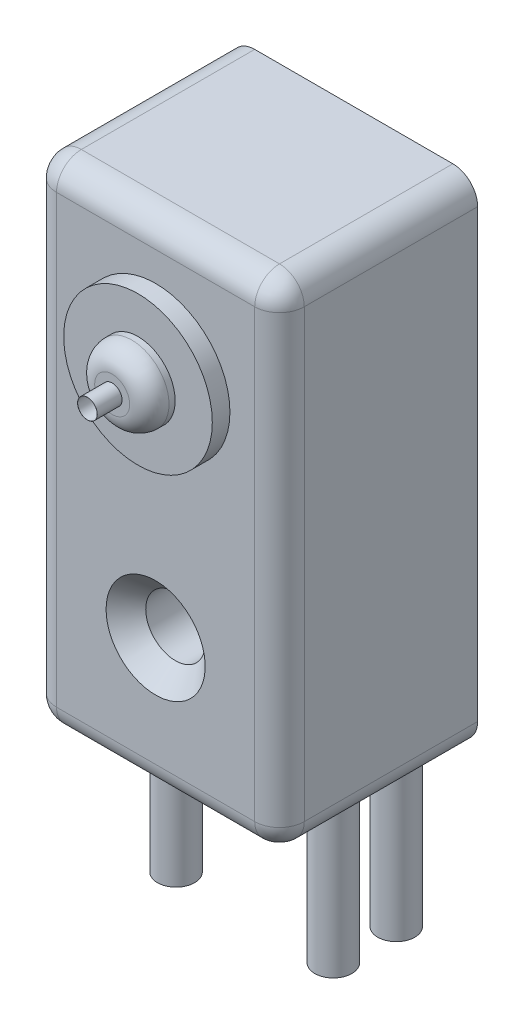
ISO-10303-21;
HEADER;
FILE_DESCRIPTION(('STEP AP214'),'2;1');
FILE_NAME('part.step','',(''),(''),'','','');
FILE_SCHEMA(('AUTOMOTIVE_DESIGN { 1 0 10303 214 1 1 1 1 }'));
ENDSEC;
DATA;
#1=APPLICATION_CONTEXT('core data for automotive mechanical design processes');
#2=APPLICATION_PROTOCOL_DEFINITION('international standard','automotive_design',2000,#1);
#3=PRODUCT_CONTEXT('',#1,'mechanical');
#4=PRODUCT('Part','Part','',(#3));
#5=PRODUCT_RELATED_PRODUCT_CATEGORY('part','',(#4));
#6=PRODUCT_DEFINITION_FORMATION('','',#4);
#7=PRODUCT_DEFINITION_CONTEXT('part definition',#1,'design');
#8=PRODUCT_DEFINITION('design','',#6,#7);
#9=PRODUCT_DEFINITION_SHAPE('','',#8);
#10=(LENGTH_UNIT() NAMED_UNIT(*) SI_UNIT(.MILLI.,.METRE.));
#11=(NAMED_UNIT(*) PLANE_ANGLE_UNIT() SI_UNIT($,.RADIAN.));
#12=(NAMED_UNIT(*) SI_UNIT($,.STERADIAN.) SOLID_ANGLE_UNIT());
#13=UNCERTAINTY_MEASURE_WITH_UNIT(LENGTH_MEASURE(1.E-05),#10,'distance_accuracy_value','');
#14=(GEOMETRIC_REPRESENTATION_CONTEXT(3) GLOBAL_UNCERTAINTY_ASSIGNED_CONTEXT((#13)) GLOBAL_UNIT_ASSIGNED_CONTEXT((#10,
#11,#12)) REPRESENTATION_CONTEXT('',''));
#15=CARTESIAN_POINT('',(0.,0.,0.));
#16=DIRECTION('',(0.,0.,1.));
#17=DIRECTION('',(1.,0.,0.));
#18=AXIS2_PLACEMENT_3D('',#15,#16,#17);
#19=CARTESIAN_POINT('',(0.,5.18314912915231,8.));
#20=DIRECTION('',(0.,1.,0.));
#21=DIRECTION('',(-1.,0.,0.));
#22=AXIS2_PLACEMENT_3D('',#19,#20,#21);
#23=PLANE('',#22);
#24=DIRECTION('',(1.,0.,0.));
#25=VECTOR('',#24,1.);
#26=CARTESIAN_POINT('',(0.,5.18314912915231,0.));
#27=LINE('',#26,#25);
#28=CARTESIAN_POINT('',(-4.,5.18314912915231,0.));
#29=VERTEX_POINT('',#28);
#30=CARTESIAN_POINT('',(4.,5.18314912915231,0.));
#31=VERTEX_POINT('',#30);
#32=EDGE_CURVE('E131',#29,#31,#27,.T.);
#33=ORIENTED_EDGE('',*,*,#32,.F.);
#34=DIRECTION('',(0.,0.,-1.));
#35=VECTOR('',#34,1.);
#36=CARTESIAN_POINT('',(-4.,5.18314912915231,8.));
#37=LINE('',#36,#35);
#38=CARTESIAN_POINT('',(-4.,5.18314912915231,7.));
#39=VERTEX_POINT('',#38);
#40=EDGE_CURVE('E275',#29,#39,#37,.F.);
#41=ORIENTED_EDGE('',*,*,#40,.T.);
#42=DIRECTION('',(1.,0.,0.));
#43=VECTOR('',#42,1.);
#44=CARTESIAN_POINT('',(0.,5.18314912915231,7.));
#45=LINE('',#44,#43);
#46=CARTESIAN_POINT('',(4.,5.18314912915231,7.));
#47=VERTEX_POINT('',#46);
#48=EDGE_CURVE('E296',#39,#47,#45,.T.);
#49=ORIENTED_EDGE('',*,*,#48,.T.);
#50=DIRECTION('',(0.,0.,-1.));
#51=VECTOR('',#50,1.);
#52=CARTESIAN_POINT('',(4.,5.18314912915231,8.));
#53=LINE('',#52,#51);
#54=EDGE_CURVE('E462',#47,#31,#53,.T.);
#55=ORIENTED_EDGE('',*,*,#54,.T.);
#56=EDGE_LOOP('',(#33,#41,#49,#55));
#57=FACE_BOUND('',#56,.T.);
#58=ADVANCED_FACE('F20',(#57),#23,.T.);
#59=CARTESIAN_POINT('',(-5.,-4.8168508708477,8.));
#60=DIRECTION('',(1.,0.,0.));
#61=DIRECTION('',(0.,1.,0.));
#62=AXIS2_PLACEMENT_3D('',#59,#60,#61);
#63=PLANE('',#62);
#64=DIRECTION('',(0.,-1.,0.));
#65=VECTOR('',#64,1.);
#66=CARTESIAN_POINT('',(-5.,5.18314912915231,7.));
#67=LINE('',#66,#65);
#68=CARTESIAN_POINT('',(-5.,-13.8168508708477,7.));
#69=VERTEX_POINT('',#68);
#70=CARTESIAN_POINT('',(-5.,4.18314912915231,7.));
#71=VERTEX_POINT('',#70);
#72=EDGE_CURVE('E42',#69,#71,#67,.F.);
#73=ORIENTED_EDGE('',*,*,#72,.T.);
#74=DIRECTION('',(0.,0.,-1.));
#75=VECTOR('',#74,1.);
#76=CARTESIAN_POINT('',(-5.,4.18314912915231,0.));
#77=LINE('',#76,#75);
#78=CARTESIAN_POINT('',(-5.,4.18314912915231,0.));
#79=VERTEX_POINT('',#78);
#80=EDGE_CURVE('E276',#71,#79,#77,.T.);
#81=ORIENTED_EDGE('',*,*,#80,.T.);
#82=DIRECTION('',(0.,-1.,0.));
#83=VECTOR('',#82,1.);
#84=CARTESIAN_POINT('',(-5.,-4.8168508708477,0.));
#85=LINE('',#84,#83);
#86=CARTESIAN_POINT('',(-5.,-13.8168508708477,0.));
#87=VERTEX_POINT('',#86);
#88=EDGE_CURVE('E378',#79,#87,#85,.T.);
#89=ORIENTED_EDGE('',*,*,#88,.T.);
#90=DIRECTION('',(0.,0.,-1.));
#91=VECTOR('',#90,1.);
#92=CARTESIAN_POINT('',(-5.,-13.8168508708477,8.));
#93=LINE('',#92,#91);
#94=EDGE_CURVE('E51',#87,#69,#93,.F.);
#95=ORIENTED_EDGE('',*,*,#94,.T.);
#96=EDGE_LOOP('',(#73,#81,#89,#95));
#97=FACE_BOUND('',#96,.T.);
#98=ADVANCED_FACE('F405',(#97),#63,.F.);
#99=CARTESIAN_POINT('',(0.,-14.8168508708477,8.));
#100=DIRECTION('',(0.,1.,0.));
#101=DIRECTION('',(-1.,0.,0.));
#102=AXIS2_PLACEMENT_3D('',#99,#100,#101);
#103=PLANE('',#102);
#104=CARTESIAN_POINT('',(3.175,-14.8168508708477,1.46));
#105=DIRECTION('',(0.,1.,0.));
#106=DIRECTION('',(-1.,0.,0.));
#107=AXIS2_PLACEMENT_3D('',#104,#105,#106);
#108=CIRCLE('',#107,0.75);
#109=CARTESIAN_POINT('',(2.425,-14.8168508708477,1.46));
#110=VERTEX_POINT('',#109);
#111=EDGE_CURVE('E12',#110,#110,#108,.F.);
#112=ORIENTED_EDGE('',*,*,#111,.F.);
#113=EDGE_LOOP('',(#112));
#114=FACE_BOUND('',#113,.T.);
#115=CARTESIAN_POINT('',(3.175,-14.8168508708477,4.));
#116=DIRECTION('',(0.,1.,0.));
#117=DIRECTION('',(1.,0.,0.));
#118=AXIS2_PLACEMENT_3D('',#115,#116,#117);
#119=CIRCLE('',#118,0.75);
#120=CARTESIAN_POINT('',(3.925,-14.8168508708477,4.));
#121=VERTEX_POINT('',#120);
#122=EDGE_CURVE('E196',#121,#121,#119,.T.);
#123=ORIENTED_EDGE('',*,*,#122,.T.);
#124=EDGE_LOOP('',(#123));
#125=FACE_BOUND('',#124,.T.);
#126=CARTESIAN_POINT('',(-3.175,-14.8168508708477,4.));
#127=DIRECTION('',(0.,1.,0.));
#128=DIRECTION('',(-1.,0.,0.));
#129=AXIS2_PLACEMENT_3D('',#126,#127,#128);
#130=CIRCLE('',#129,0.75);
#131=CARTESIAN_POINT('',(-3.925,-14.8168508708477,4.));
#132=VERTEX_POINT('',#131);
#133=EDGE_CURVE('E30',#132,#132,#130,.F.);
#134=ORIENTED_EDGE('',*,*,#133,.F.);
#135=EDGE_LOOP('',(#134));
#136=FACE_BOUND('',#135,.T.);
#137=DIRECTION('',(1.,0.,0.));
#138=VECTOR('',#137,1.);
#139=CARTESIAN_POINT('',(0.,-14.8168508708477,0.));
#140=LINE('',#139,#138);
#141=CARTESIAN_POINT('',(-4.,-14.8168508708477,0.));
#142=VERTEX_POINT('',#141);
#143=CARTESIAN_POINT('',(4.,-14.8168508708477,0.));
#144=VERTEX_POINT('',#143);
#145=EDGE_CURVE('E148',#142,#144,#140,.T.);
#146=ORIENTED_EDGE('',*,*,#145,.T.);
#147=DIRECTION('',(0.,0.,-1.));
#148=VECTOR('',#147,1.);
#149=CARTESIAN_POINT('',(4.,-14.8168508708477,8.));
#150=LINE('',#149,#148);
#151=CARTESIAN_POINT('',(4.,-14.8168508708477,7.));
#152=VERTEX_POINT('',#151);
#153=EDGE_CURVE('E465',#144,#152,#150,.F.);
#154=ORIENTED_EDGE('',*,*,#153,.T.);
#155=DIRECTION('',(1.,0.,0.));
#156=VECTOR('',#155,1.);
#157=CARTESIAN_POINT('',(-5.,-14.8168508708477,7.));
#158=LINE('',#157,#156);
#159=CARTESIAN_POINT('',(-4.,-14.8168508708477,7.));
#160=VERTEX_POINT('',#159);
#161=EDGE_CURVE('E468',#152,#160,#158,.F.);
#162=ORIENTED_EDGE('',*,*,#161,.T.);
#163=DIRECTION('',(0.,0.,-1.));
#164=VECTOR('',#163,1.);
#165=CARTESIAN_POINT('',(-4.,-14.8168508708477,8.));
#166=LINE('',#165,#164);
#167=EDGE_CURVE('E447',#160,#142,#166,.T.);
#168=ORIENTED_EDGE('',*,*,#167,.T.);
#169=EDGE_LOOP('',(#146,#154,#162,#168));
#170=FACE_BOUND('',#169,.T.);
#171=ADVANCED_FACE('F401',(#114,#125,#136,#170),#103,.F.);
#172=CARTESIAN_POINT('',(5.,-4.81685087084769,8.));
#173=DIRECTION('',(1.,0.,0.));
#174=DIRECTION('',(0.,1.,0.));
#175=AXIS2_PLACEMENT_3D('',#172,#173,#174);
#176=PLANE('',#175);
#177=DIRECTION('',(0.,-1.,0.));
#178=VECTOR('',#177,1.);
#179=CARTESIAN_POINT('',(5.,-4.81685087084769,0.));
#180=LINE('',#179,#178);
#181=CARTESIAN_POINT('',(5.,4.18314912915232,0.));
#182=VERTEX_POINT('',#181);
#183=CARTESIAN_POINT('',(5.,-13.8168508708477,0.));
#184=VERTEX_POINT('',#183);
#185=EDGE_CURVE('E128',#182,#184,#180,.T.);
#186=ORIENTED_EDGE('',*,*,#185,.F.);
#187=DIRECTION('',(0.,0.,-1.));
#188=VECTOR('',#187,1.);
#189=CARTESIAN_POINT('',(5.,4.18314912915232,8.));
#190=LINE('',#189,#188);
#191=CARTESIAN_POINT('',(5.,4.18314912915232,7.));
#192=VERTEX_POINT('',#191);
#193=EDGE_CURVE('E142',#182,#192,#190,.F.);
#194=ORIENTED_EDGE('',*,*,#193,.T.);
#195=DIRECTION('',(0.,-1.,0.));
#196=VECTOR('',#195,1.);
#197=CARTESIAN_POINT('',(5.,-4.81685087084769,7.));
#198=LINE('',#197,#196);
#199=CARTESIAN_POINT('',(5.,-13.8168508708477,7.));
#200=VERTEX_POINT('',#199);
#201=EDGE_CURVE('E156',#192,#200,#198,.T.);
#202=ORIENTED_EDGE('',*,*,#201,.T.);
#203=DIRECTION('',(0.,0.,-1.));
#204=VECTOR('',#203,1.);
#205=CARTESIAN_POINT('',(5.,-13.8168508708477,0.));
#206=LINE('',#205,#204);
#207=EDGE_CURVE('E145',#200,#184,#206,.T.);
#208=ORIENTED_EDGE('',*,*,#207,.T.);
#209=EDGE_LOOP('',(#186,#194,#202,#208));
#210=FACE_BOUND('',#209,.T.);
#211=ADVANCED_FACE('F140',(#210),#176,.T.);
#212=CARTESIAN_POINT('',(0.,-4.8168508708477,8.));
#213=DIRECTION('',(0.,0.,1.));
#214=DIRECTION('',(1.,0.,0.));
#215=AXIS2_PLACEMENT_3D('',#212,#213,#214);
#216=PLANE('',#215);
#217=CARTESIAN_POINT('',(0.,-9.39139091447953,8.));
#218=DIRECTION('',(0.,0.,-1.));
#219=DIRECTION('',(-1.,0.,0.));
#220=AXIS2_PLACEMENT_3D('',#217,#218,#219);
#221=CIRCLE('',#220,2.);
#222=CARTESIAN_POINT('',(-2.,-9.39139091447953,8.));
#223=VERTEX_POINT('',#222);
#224=EDGE_CURVE('E183',#223,#223,#221,.T.);
#225=ORIENTED_EDGE('',*,*,#224,.T.);
#226=EDGE_LOOP('',(#225));
#227=FACE_BOUND('',#226,.T.);
#228=DIRECTION('',(1.,0.,0.));
#229=VECTOR('',#228,1.);
#230=CARTESIAN_POINT('',(5.,-13.8168508708477,8.));
#231=LINE('',#230,#229);
#232=CARTESIAN_POINT('',(-4.,-13.8168508708477,8.));
#233=VERTEX_POINT('',#232);
#234=CARTESIAN_POINT('',(4.,-13.8168508708477,8.));
#235=VERTEX_POINT('',#234);
#236=EDGE_CURVE('E169',#233,#235,#231,.T.);
#237=ORIENTED_EDGE('',*,*,#236,.T.);
#238=DIRECTION('',(0.,-1.,0.));
#239=VECTOR('',#238,1.);
#240=CARTESIAN_POINT('',(4.,-4.8168508708477,8.));
#241=LINE('',#240,#239);
#242=CARTESIAN_POINT('',(4.,4.18314912915232,8.));
#243=VERTEX_POINT('',#242);
#244=EDGE_CURVE('E173',#235,#243,#241,.F.);
#245=ORIENTED_EDGE('',*,*,#244,.T.);
#246=DIRECTION('',(1.,0.,0.));
#247=VECTOR('',#246,1.);
#248=CARTESIAN_POINT('',(0.,4.18314912915232,8.));
#249=LINE('',#248,#247);
#250=CARTESIAN_POINT('',(-4.,4.18314912915231,8.));
#251=VERTEX_POINT('',#250);
#252=EDGE_CURVE('E162',#243,#251,#249,.F.);
#253=ORIENTED_EDGE('',*,*,#252,.T.);
#254=DIRECTION('',(0.,-1.,0.));
#255=VECTOR('',#254,1.);
#256=CARTESIAN_POINT('',(-4.,-14.8168508708477,8.));
#257=LINE('',#256,#255);
#258=EDGE_CURVE('E155',#251,#233,#257,.T.);
#259=ORIENTED_EDGE('',*,*,#258,.T.);
#260=EDGE_LOOP('',(#237,#245,#253,#259));
#261=FACE_BOUND('',#260,.T.);
#262=CARTESIAN_POINT('',(0.,0.,8.));
#263=DIRECTION('',(0.,0.,1.));
#264=DIRECTION('',(1.,0.,0.));
#265=AXIS2_PLACEMENT_3D('',#262,#263,#264);
#266=CIRCLE('',#265,3.);
#267=CARTESIAN_POINT('',(3.,0.,8.));
#268=VERTEX_POINT('',#267);
#269=EDGE_CURVE('E147',#268,#268,#266,.T.);
#270=ORIENTED_EDGE('',*,*,#269,.F.);
#271=EDGE_LOOP('',(#270));
#272=FACE_BOUND('',#271,.T.);
#273=ADVANCED_FACE('F285',(#227,#261,#272),#216,.T.);
#274=CARTESIAN_POINT('',(0.,-4.8168508708477,0.));
#275=DIRECTION('',(0.,0.,1.));
#276=DIRECTION('',(1.,0.,0.));
#277=AXIS2_PLACEMENT_3D('',#274,#275,#276);
#278=PLANE('',#277);
#279=CARTESIAN_POINT('',(0.,-9.39139091447953,0.));
#280=DIRECTION('',(0.,0.,1.));
#281=DIRECTION('',(1.,0.,0.));
#282=AXIS2_PLACEMENT_3D('',#279,#280,#281);
#283=CIRCLE('',#282,1.2);
#284=CARTESIAN_POINT('',(1.2,-9.39139091447953,0.));
#285=VERTEX_POINT('',#284);
#286=EDGE_CURVE('E24',#285,#285,#283,.F.);
#287=ORIENTED_EDGE('',*,*,#286,.F.);
#288=EDGE_LOOP('',(#287));
#289=FACE_BOUND('',#288,.T.);
#290=ORIENTED_EDGE('',*,*,#88,.F.);
#291=CARTESIAN_POINT('',(-4.,4.18314912915231,0.));
#292=DIRECTION('',(0.,0.,1.));
#293=DIRECTION('',(1.,0.,0.));
#294=AXIS2_PLACEMENT_3D('',#291,#292,#293);
#295=CIRCLE('',#294,1.);
#296=EDGE_CURVE('E136',#79,#29,#295,.F.);
#297=ORIENTED_EDGE('',*,*,#296,.T.);
#298=ORIENTED_EDGE('',*,*,#32,.T.);
#299=CARTESIAN_POINT('',(4.,4.18314912915232,0.));
#300=DIRECTION('',(0.,0.,1.));
#301=DIRECTION('',(1.,0.,0.));
#302=AXIS2_PLACEMENT_3D('',#299,#300,#301);
#303=CIRCLE('',#302,1.);
#304=EDGE_CURVE('E124',#31,#182,#303,.F.);
#305=ORIENTED_EDGE('',*,*,#304,.T.);
#306=ORIENTED_EDGE('',*,*,#185,.T.);
#307=CARTESIAN_POINT('',(4.,-13.8168508708477,0.));
#308=DIRECTION('',(0.,0.,1.));
#309=DIRECTION('',(1.,0.,0.));
#310=AXIS2_PLACEMENT_3D('',#307,#308,#309);
#311=CIRCLE('',#310,1.);
#312=EDGE_CURVE('E137',#184,#144,#311,.F.);
#313=ORIENTED_EDGE('',*,*,#312,.T.);
#314=ORIENTED_EDGE('',*,*,#145,.F.);
#315=CARTESIAN_POINT('',(-4.,-13.8168508708477,0.));
#316=DIRECTION('',(0.,0.,1.));
#317=DIRECTION('',(1.,0.,0.));
#318=AXIS2_PLACEMENT_3D('',#315,#316,#317);
#319=CIRCLE('',#318,1.);
#320=EDGE_CURVE('E278',#142,#87,#319,.F.);
#321=ORIENTED_EDGE('',*,*,#320,.T.);
#322=EDGE_LOOP('',(#290,#297,#298,#305,#306,#313,#314,#321));
#323=FACE_BOUND('',#322,.T.);
#324=ADVANCED_FACE('F127',(#289,#323),#278,.F.);
#325=CARTESIAN_POINT('',(0.,0.,9.7536));
#326=DIRECTION('',(0.,0.,-1.));
#327=DIRECTION('',(-1.,0.,0.));
#328=AXIS2_PLACEMENT_3D('',#325,#326,#327);
#329=CYLINDRICAL_SURFACE('',#328,1.5);
#330=CARTESIAN_POINT('',(0.,0.,8.95985));
#331=DIRECTION('',(0.,0.,1.));
#332=DIRECTION('',(1.,0.,0.));
#333=AXIS2_PLACEMENT_3D('',#330,#331,#332);
#334=CIRCLE('',#333,1.5);
#335=CARTESIAN_POINT('',(1.5,0.,8.95985));
#336=VERTEX_POINT('',#335);
#337=EDGE_CURVE('E319',#336,#336,#334,.F.);
#338=ORIENTED_EDGE('',*,*,#337,.T.);
#339=EDGE_LOOP('',(#338));
#340=FACE_BOUND('',#339,.T.);
#341=CARTESIAN_POINT('',(0.,0.,8.7122));
#342=DIRECTION('',(0.,0.,1.));
#343=DIRECTION('',(1.,0.,0.));
#344=AXIS2_PLACEMENT_3D('',#341,#342,#343);
#345=CIRCLE('',#344,1.5);
#346=CARTESIAN_POINT('',(1.5,0.,8.7122));
#347=VERTEX_POINT('',#346);
#348=EDGE_CURVE('E346',#347,#347,#345,.T.);
#349=ORIENTED_EDGE('',*,*,#348,.T.);
#350=EDGE_LOOP('',(#349));
#351=FACE_BOUND('',#350,.T.);
#352=ADVANCED_FACE('F398',(#340,#351),#329,.T.);
#353=CARTESIAN_POINT('',(0.,-4.8168508708477,9.7536));
#354=DIRECTION('',(0.,0.,1.));
#355=DIRECTION('',(1.,0.,0.));
#356=AXIS2_PLACEMENT_3D('',#353,#354,#355);
#357=PLANE('',#356);
#358=CARTESIAN_POINT('',(0.,0.,9.7536));
#359=DIRECTION('',(0.,0.,1.));
#360=DIRECTION('',(1.,0.,0.));
#361=AXIS2_PLACEMENT_3D('',#358,#359,#360);
#362=CIRCLE('',#361,0.70625);
#363=CARTESIAN_POINT('',(0.70625,0.,9.7536));
#364=VERTEX_POINT('',#363);
#365=EDGE_CURVE('E323',#364,#364,#362,.T.);
#366=ORIENTED_EDGE('',*,*,#365,.T.);
#367=EDGE_LOOP('',(#366));
#368=FACE_BOUND('',#367,.T.);
#369=CARTESIAN_POINT('',(0.,0.,9.7536));
#370=DIRECTION('',(0.,0.,1.));
#371=DIRECTION('',(1.,0.,0.));
#372=AXIS2_PLACEMENT_3D('',#369,#370,#371);
#373=CIRCLE('',#372,0.396875);
#374=CARTESIAN_POINT('',(0.396875,0.,9.7536));
#375=VERTEX_POINT('',#374);
#376=EDGE_CURVE('E329',#375,#375,#373,.T.);
#377=ORIENTED_EDGE('',*,*,#376,.F.);
#378=EDGE_LOOP('',(#377));
#379=FACE_BOUND('',#378,.T.);
#380=ADVANCED_FACE('F765',(#368,#379),#357,.T.);
#381=CARTESIAN_POINT('',(0.,0.,8.7122));
#382=DIRECTION('',(0.,0.,-1.));
#383=DIRECTION('',(-1.,0.,0.));
#384=AXIS2_PLACEMENT_3D('',#381,#382,#383);
#385=CYLINDRICAL_SURFACE('',#384,3.);
#386=ORIENTED_EDGE('',*,*,#269,.T.);
#387=EDGE_LOOP('',(#386));
#388=FACE_BOUND('',#387,.T.);
#389=CARTESIAN_POINT('',(0.,0.,8.7122));
#390=DIRECTION('',(0.,0.,1.));
#391=DIRECTION('',(1.,0.,0.));
#392=AXIS2_PLACEMENT_3D('',#389,#390,#391);
#393=CIRCLE('',#392,3.);
#394=CARTESIAN_POINT('',(3.,0.,8.7122));
#395=VERTEX_POINT('',#394);
#396=EDGE_CURVE('E350',#395,#395,#393,.T.);
#397=ORIENTED_EDGE('',*,*,#396,.F.);
#398=EDGE_LOOP('',(#397));
#399=FACE_BOUND('',#398,.T.);
#400=ADVANCED_FACE('F389',(#388,#399),#385,.T.);
#401=CARTESIAN_POINT('',(0.,-4.8168508708477,8.7122));
#402=DIRECTION('',(0.,0.,1.));
#403=DIRECTION('',(1.,0.,0.));
#404=AXIS2_PLACEMENT_3D('',#401,#402,#403);
#405=PLANE('',#404);
#406=ORIENTED_EDGE('',*,*,#348,.F.);
#407=EDGE_LOOP('',(#406));
#408=FACE_BOUND('',#407,.T.);
#409=ORIENTED_EDGE('',*,*,#396,.T.);
#410=EDGE_LOOP('',(#409));
#411=FACE_BOUND('',#410,.T.);
#412=ADVANCED_FACE('F786',(#408,#411),#405,.T.);
#413=CARTESIAN_POINT('',(0.,0.,10.7536));
#414=DIRECTION('',(0.,0.,-1.));
#415=DIRECTION('',(-1.,0.,0.));
#416=AXIS2_PLACEMENT_3D('',#413,#414,#415);
#417=CYLINDRICAL_SURFACE('',#416,0.394335);
#418=CARTESIAN_POINT('',(0.,0.,10.7536));
#419=DIRECTION('',(0.,0.,1.));
#420=DIRECTION('',(1.,0.,0.));
#421=AXIS2_PLACEMENT_3D('',#418,#419,#420);
#422=CIRCLE('',#421,0.394335);
#423=CARTESIAN_POINT('',(0.394335,0.,10.7536));
#424=VERTEX_POINT('',#423);
#425=EDGE_CURVE('E360',#424,#424,#422,.T.);
#426=ORIENTED_EDGE('',*,*,#425,.T.);
#427=EDGE_LOOP('',(#426));
#428=FACE_BOUND('',#427,.T.);
#429=CARTESIAN_POINT('',(0.,0.,9.7536));
#430=DIRECTION('',(0.,0.,1.));
#431=DIRECTION('',(1.,0.,0.));
#432=AXIS2_PLACEMENT_3D('',#429,#430,#431);
#433=CIRCLE('',#432,0.394335);
#434=CARTESIAN_POINT('',(0.394335,0.,9.7536));
#435=VERTEX_POINT('',#434);
#436=EDGE_CURVE('E213',#435,#435,#433,.T.);
#437=ORIENTED_EDGE('',*,*,#436,.F.);
#438=EDGE_LOOP('',(#437));
#439=FACE_BOUND('',#438,.T.);
#440=ADVANCED_FACE('F796',(#428,#439),#417,.F.);
#441=CARTESIAN_POINT('',(0.,0.,10.7536));
#442=DIRECTION('',(0.,0.,-1.));
#443=DIRECTION('',(-1.,0.,0.));
#444=AXIS2_PLACEMENT_3D('',#441,#442,#443);
#445=CYLINDRICAL_SURFACE('',#444,0.396875);
#446=CARTESIAN_POINT('',(0.,0.,10.7536));
#447=DIRECTION('',(0.,0.,1.));
#448=DIRECTION('',(1.,0.,0.));
#449=AXIS2_PLACEMENT_3D('',#446,#447,#448);
#450=CIRCLE('',#449,0.396875);
#451=CARTESIAN_POINT('',(0.396875,0.,10.7536));
#452=VERTEX_POINT('',#451);
#453=EDGE_CURVE('E351',#452,#452,#450,.T.);
#454=ORIENTED_EDGE('',*,*,#453,.F.);
#455=EDGE_LOOP('',(#454));
#456=FACE_BOUND('',#455,.T.);
#457=ORIENTED_EDGE('',*,*,#376,.T.);
#458=EDGE_LOOP('',(#457));
#459=FACE_BOUND('',#458,.T.);
#460=ADVANCED_FACE('F807',(#456,#459),#445,.T.);
#461=CARTESIAN_POINT('',(0.,0.,10.7536));
#462=DIRECTION('',(0.,0.,1.));
#463=DIRECTION('',(1.,0.,0.));
#464=AXIS2_PLACEMENT_3D('',#461,#462,#463);
#465=PLANE('',#464);
#466=ORIENTED_EDGE('',*,*,#425,.F.);
#467=EDGE_LOOP('',(#466));
#468=FACE_BOUND('',#467,.T.);
#469=ORIENTED_EDGE('',*,*,#453,.T.);
#470=EDGE_LOOP('',(#469));
#471=FACE_BOUND('',#470,.T.);
#472=ADVANCED_FACE('F816',(#468,#471),#465,.T.);
#473=ORIENTED_EDGE('',*,*,#436,.T.);
#474=EDGE_LOOP('',(#473));
#475=FACE_BOUND('',#474,.T.);
#476=ADVANCED_FACE('F416',(#475),#357,.T.);
#477=CARTESIAN_POINT('',(0.,0.,8.95985));
#478=DIRECTION('',(0.,0.,1.));
#479=DIRECTION('',(1.,0.,0.));
#480=AXIS2_PLACEMENT_3D('',#477,#478,#479);
#481=DEGENERATE_TOROIDAL_SURFACE('',#480,0.70625,0.79375,.T.);
#482=ORIENTED_EDGE('',*,*,#337,.F.);
#483=EDGE_LOOP('',(#482));
#484=FACE_BOUND('',#483,.T.);
#485=ORIENTED_EDGE('',*,*,#365,.F.);
#486=EDGE_LOOP('',(#485));
#487=FACE_BOUND('',#486,.T.);
#488=ADVANCED_FACE('F413',(#484,#487),#481,.T.);
#489=CARTESIAN_POINT('',(-4.,4.18314912915231,8.));
#490=DIRECTION('',(0.,0.,1.));
#491=DIRECTION('',(1.,0.,0.));
#492=AXIS2_PLACEMENT_3D('',#489,#490,#491);
#493=CYLINDRICAL_SURFACE('',#492,1.);
#494=ORIENTED_EDGE('',*,*,#296,.F.);
#495=ORIENTED_EDGE('',*,*,#80,.F.);
#496=CARTESIAN_POINT('',(-4.,4.18314912915231,7.));
#497=DIRECTION('',(0.,0.,1.));
#498=DIRECTION('',(1.,0.,0.));
#499=AXIS2_PLACEMENT_3D('',#496,#497,#498);
#500=CIRCLE('',#499,1.);
#501=EDGE_CURVE('E214',#39,#71,#500,.T.);
#502=ORIENTED_EDGE('',*,*,#501,.F.);
#503=ORIENTED_EDGE('',*,*,#40,.F.);
#504=EDGE_LOOP('',(#494,#495,#502,#503));
#505=FACE_BOUND('',#504,.T.);
#506=ADVANCED_FACE('F22',(#505),#493,.T.);
#507=CARTESIAN_POINT('',(-4.,-13.8168508708477,8.));
#508=DIRECTION('',(0.,0.,-1.));
#509=DIRECTION('',(-1.,0.,0.));
#510=AXIS2_PLACEMENT_3D('',#507,#508,#509);
#511=CYLINDRICAL_SURFACE('',#510,1.);
#512=ORIENTED_EDGE('',*,*,#320,.F.);
#513=ORIENTED_EDGE('',*,*,#167,.F.);
#514=CARTESIAN_POINT('',(-4.,-13.8168508708477,7.));
#515=DIRECTION('',(0.,0.,1.));
#516=DIRECTION('',(1.,0.,0.));
#517=AXIS2_PLACEMENT_3D('',#514,#515,#516);
#518=CIRCLE('',#517,1.);
#519=EDGE_CURVE('E254',#69,#160,#518,.T.);
#520=ORIENTED_EDGE('',*,*,#519,.F.);
#521=ORIENTED_EDGE('',*,*,#94,.F.);
#522=EDGE_LOOP('',(#512,#513,#520,#521));
#523=FACE_BOUND('',#522,.T.);
#524=ADVANCED_FACE('F440',(#523),#511,.T.);
#525=CARTESIAN_POINT('',(-4.,-4.8168508708477,7.));
#526=DIRECTION('',(0.,1.,0.));
#527=DIRECTION('',(-1.,0.,0.));
#528=AXIS2_PLACEMENT_3D('',#525,#526,#527);
#529=CYLINDRICAL_SURFACE('',#528,1.);
#530=CARTESIAN_POINT('',(-4.,4.18314912915231,7.));
#531=DIRECTION('',(0.,1.,0.));
#532=DIRECTION('',(0.,0.,1.));
#533=AXIS2_PLACEMENT_3D('',#530,#531,#532);
#534=CIRCLE('',#533,1.);
#535=EDGE_CURVE('E208',#71,#251,#534,.T.);
#536=ORIENTED_EDGE('',*,*,#535,.F.);
#537=ORIENTED_EDGE('',*,*,#72,.F.);
#538=CARTESIAN_POINT('',(-4.,-13.8168508708477,7.));
#539=DIRECTION('',(0.,-1.,0.));
#540=DIRECTION('',(0.,0.,-1.));
#541=AXIS2_PLACEMENT_3D('',#538,#539,#540);
#542=CIRCLE('',#541,1.);
#543=EDGE_CURVE('E249',#233,#69,#542,.T.);
#544=ORIENTED_EDGE('',*,*,#543,.F.);
#545=ORIENTED_EDGE('',*,*,#258,.F.);
#546=EDGE_LOOP('',(#536,#537,#544,#545));
#547=FACE_BOUND('',#546,.T.);
#548=ADVANCED_FACE('F282',(#547),#529,.T.);
#549=CARTESIAN_POINT('',(-4.,4.18314912915231,7.));
#550=DIRECTION('',(-1.,0.,0.));
#551=DIRECTION('',(0.,-1.,0.));
#552=AXIS2_PLACEMENT_3D('',#549,#550,#551);
#553=SPHERICAL_SURFACE('',#552,1.);
#554=ORIENTED_EDGE('',*,*,#501,.T.);
#555=ORIENTED_EDGE('',*,*,#535,.T.);
#556=CARTESIAN_POINT('',(-4.,4.18314912915231,7.));
#557=DIRECTION('',(-1.,0.,0.));
#558=DIRECTION('',(0.,-1.,0.));
#559=AXIS2_PLACEMENT_3D('',#556,#557,#558);
#560=CIRCLE('',#559,1.);
#561=EDGE_CURVE('E255',#39,#251,#560,.F.);
#562=ORIENTED_EDGE('',*,*,#561,.F.);
#563=EDGE_LOOP('',(#554,#555,#562));
#564=FACE_BOUND('',#563,.T.);
#565=ADVANCED_FACE('F269',(#564),#553,.T.);
#566=CARTESIAN_POINT('',(-4.,-13.8168508708477,7.));
#567=DIRECTION('',(-1.,0.,0.));
#568=DIRECTION('',(0.,0.,1.));
#569=AXIS2_PLACEMENT_3D('',#566,#567,#568);
#570=SPHERICAL_SURFACE('',#569,1.);
#571=ORIENTED_EDGE('',*,*,#543,.T.);
#572=ORIENTED_EDGE('',*,*,#519,.T.);
#573=CARTESIAN_POINT('',(-4.,-13.8168508708477,7.));
#574=DIRECTION('',(-1.,0.,0.));
#575=DIRECTION('',(0.,0.,1.));
#576=AXIS2_PLACEMENT_3D('',#573,#574,#575);
#577=CIRCLE('',#576,1.);
#578=EDGE_CURVE('E298',#233,#160,#577,.F.);
#579=ORIENTED_EDGE('',*,*,#578,.F.);
#580=EDGE_LOOP('',(#571,#572,#579));
#581=FACE_BOUND('',#580,.T.);
#582=ADVANCED_FACE('F434',(#581),#570,.T.);
#583=CARTESIAN_POINT('',(0.,4.18314912915231,7.));
#584=DIRECTION('',(1.,0.,0.));
#585=DIRECTION('',(0.,1.,0.));
#586=AXIS2_PLACEMENT_3D('',#583,#584,#585);
#587=CYLINDRICAL_SURFACE('',#586,1.);
#588=ORIENTED_EDGE('',*,*,#561,.T.);
#589=ORIENTED_EDGE('',*,*,#252,.F.);
#590=CARTESIAN_POINT('',(4.,4.18314912915232,7.));
#591=DIRECTION('',(1.,0.,0.));
#592=DIRECTION('',(0.,0.,-1.));
#593=AXIS2_PLACEMENT_3D('',#590,#591,#592);
#594=CIRCLE('',#593,1.);
#595=EDGE_CURVE('E246',#47,#243,#594,.T.);
#596=ORIENTED_EDGE('',*,*,#595,.F.);
#597=ORIENTED_EDGE('',*,*,#48,.F.);
#598=EDGE_LOOP('',(#588,#589,#596,#597));
#599=FACE_BOUND('',#598,.T.);
#600=ADVANCED_FACE('F294',(#599),#587,.T.);
#601=CARTESIAN_POINT('',(4.,4.18314912915232,8.));
#602=DIRECTION('',(0.,0.,-1.));
#603=DIRECTION('',(-1.,0.,0.));
#604=AXIS2_PLACEMENT_3D('',#601,#602,#603);
#605=CYLINDRICAL_SURFACE('',#604,1.);
#606=ORIENTED_EDGE('',*,*,#304,.F.);
#607=ORIENTED_EDGE('',*,*,#54,.F.);
#608=CARTESIAN_POINT('',(4.,4.18314912915232,7.));
#609=DIRECTION('',(0.,0.,1.));
#610=DIRECTION('',(1.,0.,0.));
#611=AXIS2_PLACEMENT_3D('',#608,#609,#610);
#612=CIRCLE('',#611,1.);
#613=EDGE_CURVE('E152',#192,#47,#612,.T.);
#614=ORIENTED_EDGE('',*,*,#613,.F.);
#615=ORIENTED_EDGE('',*,*,#193,.F.);
#616=EDGE_LOOP('',(#606,#607,#614,#615));
#617=FACE_BOUND('',#616,.T.);
#618=ADVANCED_FACE('F150',(#617),#605,.T.);
#619=CARTESIAN_POINT('',(4.,-13.8168508708477,8.));
#620=DIRECTION('',(0.,0.,1.));
#621=DIRECTION('',(1.,0.,0.));
#622=AXIS2_PLACEMENT_3D('',#619,#620,#621);
#623=CYLINDRICAL_SURFACE('',#622,1.);
#624=ORIENTED_EDGE('',*,*,#312,.F.);
#625=ORIENTED_EDGE('',*,*,#207,.F.);
#626=CARTESIAN_POINT('',(4.,-13.8168508708477,7.));
#627=DIRECTION('',(0.,0.,1.));
#628=DIRECTION('',(1.,0.,0.));
#629=AXIS2_PLACEMENT_3D('',#626,#627,#628);
#630=CIRCLE('',#629,1.);
#631=EDGE_CURVE('E239',#152,#200,#630,.T.);
#632=ORIENTED_EDGE('',*,*,#631,.F.);
#633=ORIENTED_EDGE('',*,*,#153,.F.);
#634=EDGE_LOOP('',(#624,#625,#632,#633));
#635=FACE_BOUND('',#634,.T.);
#636=ADVANCED_FACE('F317',(#635),#623,.T.);
#637=CARTESIAN_POINT('',(0.,-13.8168508708477,7.));
#638=DIRECTION('',(-1.,0.,0.));
#639=DIRECTION('',(0.,-1.,0.));
#640=AXIS2_PLACEMENT_3D('',#637,#638,#639);
#641=CYLINDRICAL_SURFACE('',#640,1.);
#642=ORIENTED_EDGE('',*,*,#578,.T.);
#643=ORIENTED_EDGE('',*,*,#161,.F.);
#644=CARTESIAN_POINT('',(4.,-13.8168508708477,7.));
#645=DIRECTION('',(1.,0.,0.));
#646=DIRECTION('',(0.,1.,0.));
#647=AXIS2_PLACEMENT_3D('',#644,#645,#646);
#648=CIRCLE('',#647,1.);
#649=EDGE_CURVE('E234',#235,#152,#648,.T.);
#650=ORIENTED_EDGE('',*,*,#649,.F.);
#651=ORIENTED_EDGE('',*,*,#236,.F.);
#652=EDGE_LOOP('',(#642,#643,#650,#651));
#653=FACE_BOUND('',#652,.T.);
#654=ADVANCED_FACE('F425',(#653),#641,.T.);
#655=CARTESIAN_POINT('',(4.,4.18314912915232,7.));
#656=DIRECTION('',(0.,1.,0.));
#657=DIRECTION('',(0.,0.,1.));
#658=AXIS2_PLACEMENT_3D('',#655,#656,#657);
#659=SPHERICAL_SURFACE('',#658,1.);
#660=ORIENTED_EDGE('',*,*,#613,.T.);
#661=ORIENTED_EDGE('',*,*,#595,.T.);
#662=CARTESIAN_POINT('',(4.,4.18314912915232,7.));
#663=DIRECTION('',(0.,1.,0.));
#664=DIRECTION('',(-1.,0.,0.));
#665=AXIS2_PLACEMENT_3D('',#662,#663,#664);
#666=CIRCLE('',#665,1.);
#667=EDGE_CURVE('E231',#192,#243,#666,.F.);
#668=ORIENTED_EDGE('',*,*,#667,.F.);
#669=EDGE_LOOP('',(#660,#661,#668));
#670=FACE_BOUND('',#669,.T.);
#671=ADVANCED_FACE('F307',(#670),#659,.T.);
#672=CARTESIAN_POINT('',(4.,-13.8168508708477,7.));
#673=DIRECTION('',(0.,-1.,0.));
#674=DIRECTION('',(0.,0.,-1.));
#675=AXIS2_PLACEMENT_3D('',#672,#673,#674);
#676=SPHERICAL_SURFACE('',#675,1.);
#677=ORIENTED_EDGE('',*,*,#649,.T.);
#678=ORIENTED_EDGE('',*,*,#631,.T.);
#679=CARTESIAN_POINT('',(4.,-13.8168508708477,7.));
#680=DIRECTION('',(0.,-1.,0.));
#681=DIRECTION('',(0.,0.,-1.));
#682=AXIS2_PLACEMENT_3D('',#679,#680,#681);
#683=CIRCLE('',#682,1.);
#684=EDGE_CURVE('E228',#235,#200,#683,.F.);
#685=ORIENTED_EDGE('',*,*,#684,.F.);
#686=EDGE_LOOP('',(#677,#678,#685));
#687=FACE_BOUND('',#686,.T.);
#688=ADVANCED_FACE('F314',(#687),#676,.T.);
#689=CARTESIAN_POINT('',(4.,-4.81685087084769,7.));
#690=DIRECTION('',(0.,-1.,0.));
#691=DIRECTION('',(1.,0.,0.));
#692=AXIS2_PLACEMENT_3D('',#689,#690,#691);
#693=CYLINDRICAL_SURFACE('',#692,1.);
#694=ORIENTED_EDGE('',*,*,#667,.T.);
#695=ORIENTED_EDGE('',*,*,#244,.F.);
#696=ORIENTED_EDGE('',*,*,#684,.T.);
#697=ORIENTED_EDGE('',*,*,#201,.F.);
#698=EDGE_LOOP('',(#694,#695,#696,#697));
#699=FACE_BOUND('',#698,.T.);
#700=ADVANCED_FACE('F310',(#699),#693,.T.);
#701=CARTESIAN_POINT('',(-3.175,-21.1668508708477,4.));
#702=DIRECTION('',(0.,1.,0.));
#703=DIRECTION('',(-1.,0.,0.));
#704=AXIS2_PLACEMENT_3D('',#701,#702,#703);
#705=CYLINDRICAL_SURFACE('',#704,0.75);
#706=CARTESIAN_POINT('',(-3.175,-21.1668508708477,4.));
#707=DIRECTION('',(0.,-1.,0.));
#708=DIRECTION('',(1.,0.,0.));
#709=AXIS2_PLACEMENT_3D('',#706,#707,#708);
#710=CIRCLE('',#709,0.75);
#711=CARTESIAN_POINT('',(-2.425,-21.1668508708477,4.));
#712=VERTEX_POINT('',#711);
#713=EDGE_CURVE('E232',#712,#712,#710,.T.);
#714=ORIENTED_EDGE('',*,*,#713,.F.);
#715=EDGE_LOOP('',(#714));
#716=FACE_BOUND('',#715,.T.);
#717=ORIENTED_EDGE('',*,*,#133,.T.);
#718=EDGE_LOOP('',(#717));
#719=FACE_BOUND('',#718,.T.);
#720=ADVANCED_FACE('F420',(#716,#719),#705,.T.);
#721=CARTESIAN_POINT('',(0.,-21.1668508708477,4.));
#722=DIRECTION('',(0.,-1.,0.));
#723=DIRECTION('',(1.,0.,0.));
#724=AXIS2_PLACEMENT_3D('',#721,#722,#723);
#725=PLANE('',#724);
#726=ORIENTED_EDGE('',*,*,#713,.T.);
#727=EDGE_LOOP('',(#726));
#728=FACE_BOUND('',#727,.T.);
#729=ADVANCED_FACE('F646',(#728),#725,.T.);
#730=CARTESIAN_POINT('',(3.175,-21.1668508708477,4.));
#731=DIRECTION('',(0.,1.,0.));
#732=DIRECTION('',(-1.,0.,0.));
#733=AXIS2_PLACEMENT_3D('',#730,#731,#732);
#734=CYLINDRICAL_SURFACE('',#733,0.75);
#735=CARTESIAN_POINT('',(3.175,-21.1668508708477,4.));
#736=DIRECTION('',(0.,1.,0.));
#737=DIRECTION('',(1.,0.,0.));
#738=AXIS2_PLACEMENT_3D('',#735,#736,#737);
#739=CIRCLE('',#738,0.75);
#740=CARTESIAN_POINT('',(3.925,-21.1668508708477,4.));
#741=VERTEX_POINT('',#740);
#742=EDGE_CURVE('E197',#741,#741,#739,.T.);
#743=ORIENTED_EDGE('',*,*,#742,.T.);
#744=EDGE_LOOP('',(#743));
#745=FACE_BOUND('',#744,.T.);
#746=ORIENTED_EDGE('',*,*,#122,.F.);
#747=EDGE_LOOP('',(#746));
#748=FACE_BOUND('',#747,.T.);
#749=ADVANCED_FACE('F658',(#745,#748),#734,.T.);
#750=CARTESIAN_POINT('',(0.,-21.1668508708477,4.));
#751=DIRECTION('',(0.,-1.,0.));
#752=DIRECTION('',(1.,0.,0.));
#753=AXIS2_PLACEMENT_3D('',#750,#751,#752);
#754=PLANE('',#753);
#755=ORIENTED_EDGE('',*,*,#742,.F.);
#756=EDGE_LOOP('',(#755));
#757=FACE_BOUND('',#756,.T.);
#758=ADVANCED_FACE('F670',(#757),#754,.T.);
#759=CARTESIAN_POINT('',(3.175,-21.1668508708477,1.46));
#760=DIRECTION('',(0.,1.,0.));
#761=DIRECTION('',(-1.,0.,0.));
#762=AXIS2_PLACEMENT_3D('',#759,#760,#761);
#763=CYLINDRICAL_SURFACE('',#762,0.75);
#764=CARTESIAN_POINT('',(3.175,-21.1668508708477,1.46));
#765=DIRECTION('',(0.,-1.,0.));
#766=DIRECTION('',(1.,0.,0.));
#767=AXIS2_PLACEMENT_3D('',#764,#765,#766);
#768=CIRCLE('',#767,0.75);
#769=CARTESIAN_POINT('',(3.925,-21.1668508708477,1.46));
#770=VERTEX_POINT('',#769);
#771=EDGE_CURVE('E191',#770,#770,#768,.T.);
#772=ORIENTED_EDGE('',*,*,#771,.F.);
#773=EDGE_LOOP('',(#772));
#774=FACE_BOUND('',#773,.T.);
#775=ORIENTED_EDGE('',*,*,#111,.T.);
#776=EDGE_LOOP('',(#775));
#777=FACE_BOUND('',#776,.T.);
#778=ADVANCED_FACE('F679',(#774,#777),#763,.T.);
#779=CARTESIAN_POINT('',(0.,-21.1668508708477,4.));
#780=DIRECTION('',(0.,-1.,0.));
#781=DIRECTION('',(1.,0.,0.));
#782=AXIS2_PLACEMENT_3D('',#779,#780,#781);
#783=PLANE('',#782);
#784=ORIENTED_EDGE('',*,*,#771,.T.);
#785=EDGE_LOOP('',(#784));
#786=FACE_BOUND('',#785,.T.);
#787=ADVANCED_FACE('F692',(#786),#783,.T.);
#788=CARTESIAN_POINT('',(0.,-9.39139091447953,8.25));
#789=DIRECTION('',(0.,0.,-1.));
#790=DIRECTION('',(-1.,0.,0.));
#791=AXIS2_PLACEMENT_3D('',#788,#789,#790);
#792=CYLINDRICAL_SURFACE('',#791,1.2);
#793=CARTESIAN_POINT('',(0.,-9.39139091447953,7.2));
#794=DIRECTION('',(0.,0.,-1.));
#795=DIRECTION('',(-1.,0.,0.));
#796=AXIS2_PLACEMENT_3D('',#793,#794,#795);
#797=CIRCLE('',#796,1.2);
#798=CARTESIAN_POINT('',(-1.2,-9.39139091447953,7.2));
#799=VERTEX_POINT('',#798);
#800=EDGE_CURVE('E189',#799,#799,#797,.T.);
#801=ORIENTED_EDGE('',*,*,#800,.F.);
#802=EDGE_LOOP('',(#801));
#803=FACE_BOUND('',#802,.T.);
#804=ORIENTED_EDGE('',*,*,#286,.T.);
#805=EDGE_LOOP('',(#804));
#806=FACE_BOUND('',#805,.T.);
#807=ADVANCED_FACE('F700',(#803,#806),#792,.F.);
#808=CARTESIAN_POINT('',(0.,-9.39139091447953,8.));
#809=DIRECTION('',(0.,0.,1.));
#810=DIRECTION('',(1.,0.,0.));
#811=AXIS2_PLACEMENT_3D('',#808,#809,#810);
#812=CONICAL_SURFACE('',#811,2.,0.785398163397448);
#813=ORIENTED_EDGE('',*,*,#800,.T.);
#814=EDGE_LOOP('',(#813));
#815=FACE_BOUND('',#814,.T.);
#816=ORIENTED_EDGE('',*,*,#224,.F.);
#817=EDGE_LOOP('',(#816));
#818=FACE_BOUND('',#817,.T.);
#819=ADVANCED_FACE('F729',(#815,#818),#812,.F.);
#820=CLOSED_SHELL('',(#58,#98,#171,#211,#273,#324,#352,#380,#400,#412,#440,#460,#472,#476,#488,
#506,#524,#548,#565,#582,#600,#618,#636,#654,#671,#688,#700,#720,#729,#749,#758,#778,#787,#807,#819));
#821=MANIFOLD_SOLID_BREP('B1',#820);
#822=ADVANCED_BREP_SHAPE_REPRESENTATION('',(#18,#821),#14);
#823=SHAPE_DEFINITION_REPRESENTATION(#9,#822);
ENDSEC;
END-ISO-10303-21;
